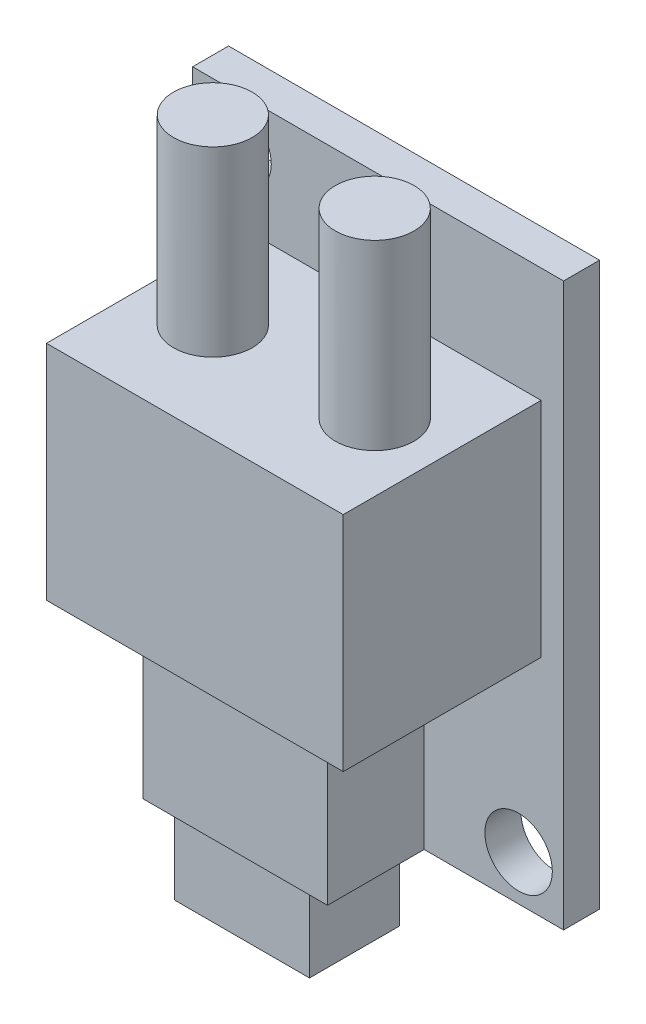
ISO-10303-21;
HEADER;
FILE_DESCRIPTION(('STEP AP214'),'2;1');
FILE_NAME('part.step','',(''),(''),'','','');
FILE_SCHEMA(('AUTOMOTIVE_DESIGN { 1 0 10303 214 1 1 1 1 }'));
ENDSEC;
DATA;
#1=APPLICATION_CONTEXT('core data for automotive mechanical design processes');
#2=APPLICATION_PROTOCOL_DEFINITION('international standard','automotive_design',2000,#1);
#3=PRODUCT_CONTEXT('',#1,'mechanical');
#4=PRODUCT('Part','Part','',(#3));
#5=PRODUCT_RELATED_PRODUCT_CATEGORY('part','',(#4));
#6=PRODUCT_DEFINITION_FORMATION('','',#4);
#7=PRODUCT_DEFINITION_CONTEXT('part definition',#1,'design');
#8=PRODUCT_DEFINITION('design','',#6,#7);
#9=PRODUCT_DEFINITION_SHAPE('','',#8);
#10=(LENGTH_UNIT() NAMED_UNIT(*) SI_UNIT(.MILLI.,.METRE.));
#11=(NAMED_UNIT(*) PLANE_ANGLE_UNIT() SI_UNIT($,.RADIAN.));
#12=(NAMED_UNIT(*) SI_UNIT($,.STERADIAN.) SOLID_ANGLE_UNIT());
#13=UNCERTAINTY_MEASURE_WITH_UNIT(LENGTH_MEASURE(1.E-05),#10,'distance_accuracy_value','');
#14=(GEOMETRIC_REPRESENTATION_CONTEXT(3) GLOBAL_UNCERTAINTY_ASSIGNED_CONTEXT((#13)) GLOBAL_UNIT_ASSIGNED_CONTEXT((#10,
#11,#12)) REPRESENTATION_CONTEXT('',''));
#15=CARTESIAN_POINT('',(0.,0.,0.));
#16=DIRECTION('',(0.,0.,1.));
#17=DIRECTION('',(1.,0.,0.));
#18=AXIS2_PLACEMENT_3D('',#15,#16,#17);
#19=CARTESIAN_POINT('',(-8.24999999999999,-12.5,1.6));
#20=DIRECTION('',(0.,1.,0.));
#21=DIRECTION('',(0.,0.,1.));
#22=AXIS2_PLACEMENT_3D('',#19,#20,#21);
#23=PLANE('',#22);
#24=DIRECTION('',(1.,0.,0.));
#25=VECTOR('',#24,1.);
#26=CARTESIAN_POINT('',(-8.24999999999999,-12.5,0.));
#27=LINE('',#26,#25);
#28=CARTESIAN_POINT('',(-8.24999999999999,-12.5,0.));
#29=VERTEX_POINT('',#28);
#30=CARTESIAN_POINT('',(8.25000000000001,-12.5,0.));
#31=VERTEX_POINT('',#30);
#32=EDGE_CURVE('E280',#29,#31,#27,.T.);
#33=ORIENTED_EDGE('',*,*,#32,.T.);
#34=DIRECTION('',(0.,0.,-1.));
#35=VECTOR('',#34,1.);
#36=CARTESIAN_POINT('',(8.25000000000001,-12.5,1.6));
#37=LINE('',#36,#35);
#38=CARTESIAN_POINT('',(8.25000000000001,-12.5,1.6));
#39=VERTEX_POINT('',#38);
#40=EDGE_CURVE('E290',#39,#31,#37,.T.);
#41=ORIENTED_EDGE('',*,*,#40,.F.);
#42=DIRECTION('',(1.,0.,0.));
#43=VECTOR('',#42,1.);
#44=CARTESIAN_POINT('',(-8.24999999999999,-12.5,1.6));
#45=LINE('',#44,#43);
#46=CARTESIAN_POINT('',(2.05,-12.5,1.6));
#47=VERTEX_POINT('',#46);
#48=EDGE_CURVE('E269',#47,#39,#45,.T.);
#49=ORIENTED_EDGE('',*,*,#48,.F.);
#50=DIRECTION('',(0.,0.,-1.));
#51=VECTOR('',#50,1.);
#52=CARTESIAN_POINT('',(2.05,-12.5,5.9));
#53=LINE('',#52,#51);
#54=CARTESIAN_POINT('',(2.05,-12.5,5.9));
#55=VERTEX_POINT('',#54);
#56=EDGE_CURVE('E208',#55,#47,#53,.T.);
#57=ORIENTED_EDGE('',*,*,#56,.F.);
#58=DIRECTION('',(1.,0.,0.));
#59=VECTOR('',#58,1.);
#60=CARTESIAN_POINT('',(-6.15,-12.5,5.9));
#61=LINE('',#60,#59);
#62=CARTESIAN_POINT('',(-6.15,-12.5,5.9));
#63=VERTEX_POINT('',#62);
#64=EDGE_CURVE('E191',#63,#55,#61,.T.);
#65=ORIENTED_EDGE('',*,*,#64,.F.);
#66=DIRECTION('',(0.,0.,-1.));
#67=VECTOR('',#66,1.);
#68=CARTESIAN_POINT('',(-6.15,-12.5,5.9));
#69=LINE('',#68,#67);
#70=CARTESIAN_POINT('',(-6.15,-12.5,1.6));
#71=VERTEX_POINT('',#70);
#72=EDGE_CURVE('E211',#63,#71,#69,.T.);
#73=ORIENTED_EDGE('',*,*,#72,.T.);
#74=CARTESIAN_POINT('',(-8.24999999999999,-12.5,1.6));
#75=VERTEX_POINT('',#74);
#76=EDGE_CURVE('E271',#75,#71,#45,.T.);
#77=ORIENTED_EDGE('',*,*,#76,.F.);
#78=DIRECTION('',(0.,0.,-1.));
#79=VECTOR('',#78,1.);
#80=CARTESIAN_POINT('',(-8.24999999999999,-12.5,1.6));
#81=LINE('',#80,#79);
#82=EDGE_CURVE('E293',#75,#29,#81,.T.);
#83=ORIENTED_EDGE('',*,*,#82,.T.);
#84=EDGE_LOOP('',(#33,#41,#49,#57,#65,#73,#77,#83));
#85=FACE_BOUND('',#84,.T.);
#86=DIRECTION('',(0.,0.,-1.));
#87=VECTOR('',#86,1.);
#88=CARTESIAN_POINT('',(-5.05,-12.5,5.6));
#89=LINE('',#88,#87);
#90=CARTESIAN_POINT('',(-5.05,-12.5,5.6));
#91=VERTEX_POINT('',#90);
#92=CARTESIAN_POINT('',(-5.05,-12.5,1.6));
#93=VERTEX_POINT('',#92);
#94=EDGE_CURVE('E178',#91,#93,#89,.T.);
#95=ORIENTED_EDGE('',*,*,#94,.F.);
#96=DIRECTION('',(-1.,0.,0.));
#97=VECTOR('',#96,1.);
#98=CARTESIAN_POINT('',(-5.05,-12.5,5.6));
#99=LINE('',#98,#97);
#100=CARTESIAN_POINT('',(0.95,-12.5,5.6));
#101=VERTEX_POINT('',#100);
#102=EDGE_CURVE('E175',#101,#91,#99,.T.);
#103=ORIENTED_EDGE('',*,*,#102,.F.);
#104=DIRECTION('',(0.,0.,1.));
#105=VECTOR('',#104,1.);
#106=CARTESIAN_POINT('',(0.95,-12.5,5.6));
#107=LINE('',#106,#105);
#108=CARTESIAN_POINT('',(0.95,-12.5,1.6));
#109=VERTEX_POINT('',#108);
#110=EDGE_CURVE('E65',#109,#101,#107,.T.);
#111=ORIENTED_EDGE('',*,*,#110,.F.);
#112=DIRECTION('',(1.,0.,0.));
#113=VECTOR('',#112,1.);
#114=CARTESIAN_POINT('',(-5.05,-12.5,1.6));
#115=LINE('',#114,#113);
#116=EDGE_CURVE('E60',#93,#109,#115,.T.);
#117=ORIENTED_EDGE('',*,*,#116,.F.);
#118=EDGE_LOOP('',(#95,#103,#111,#117));
#119=FACE_BOUND('',#118,.T.);
#120=ADVANCED_FACE('F45',(#85,#119),#23,.F.);
#121=CARTESIAN_POINT('',(0.,0.,1.6));
#122=DIRECTION('',(0.,0.,-1.));
#123=DIRECTION('',(-1.,0.,0.));
#124=AXIS2_PLACEMENT_3D('',#121,#122,#123);
#125=PLANE('',#124);
#126=DIRECTION('',(0.,-1.,0.));
#127=VECTOR('',#126,1.);
#128=CARTESIAN_POINT('',(-5.94999999999999,7.4,1.6));
#129=LINE('',#128,#127);
#130=CARTESIAN_POINT('',(-5.94999999999999,7.4,1.6));
#131=VERTEX_POINT('',#130);
#132=CARTESIAN_POINT('',(-5.94999999999999,-2.5,1.6));
#133=VERTEX_POINT('',#132);
#134=EDGE_CURVE('E220',#131,#133,#129,.T.);
#135=ORIENTED_EDGE('',*,*,#134,.F.);
#136=DIRECTION('',(-1.,0.,0.));
#137=VECTOR('',#136,1.);
#138=CARTESIAN_POINT('',(-5.94999999999999,7.4,1.6));
#139=LINE('',#138,#137);
#140=CARTESIAN_POINT('',(7.25,7.4,1.6));
#141=VERTEX_POINT('',#140);
#142=EDGE_CURVE('E225',#141,#131,#139,.T.);
#143=ORIENTED_EDGE('',*,*,#142,.F.);
#144=DIRECTION('',(0.,1.,0.));
#145=VECTOR('',#144,1.);
#146=CARTESIAN_POINT('',(7.25,7.4,1.6));
#147=LINE('',#146,#145);
#148=CARTESIAN_POINT('',(7.25000000000001,-2.5,1.6));
#149=VERTEX_POINT('',#148);
#150=EDGE_CURVE('E237',#149,#141,#147,.T.);
#151=ORIENTED_EDGE('',*,*,#150,.F.);
#152=DIRECTION('',(1.,0.,0.));
#153=VECTOR('',#152,1.);
#154=CARTESIAN_POINT('',(-5.94999999999999,-2.5,1.6));
#155=LINE('',#154,#153);
#156=EDGE_CURVE('E234',#133,#149,#155,.T.);
#157=ORIENTED_EDGE('',*,*,#156,.F.);
#158=EDGE_LOOP('',(#135,#143,#151,#157));
#159=FACE_BOUND('',#158,.T.);
#160=CARTESIAN_POINT('',(6.25000000000001,-10.5,1.6));
#161=DIRECTION('',(0.,0.,1.));
#162=DIRECTION('',(1.,0.,0.));
#163=AXIS2_PLACEMENT_3D('',#160,#161,#162);
#164=CIRCLE('',#163,1.5);
#165=CARTESIAN_POINT('',(7.75000000000001,-10.5,1.6));
#166=VERTEX_POINT('',#165);
#167=EDGE_CURVE('E253',#166,#166,#164,.T.);
#168=ORIENTED_EDGE('',*,*,#167,.F.);
#169=EDGE_LOOP('',(#168));
#170=FACE_BOUND('',#169,.T.);
#171=CARTESIAN_POINT('',(-6.25,10.5,1.6));
#172=DIRECTION('',(0.,0.,1.));
#173=DIRECTION('',(1.,0.,0.));
#174=AXIS2_PLACEMENT_3D('',#171,#172,#173);
#175=CIRCLE('',#174,1.5);
#176=CARTESIAN_POINT('',(-4.75,10.5,1.6));
#177=VERTEX_POINT('',#176);
#178=EDGE_CURVE('E257',#177,#177,#175,.T.);
#179=ORIENTED_EDGE('',*,*,#178,.F.);
#180=EDGE_LOOP('',(#179));
#181=FACE_BOUND('',#180,.T.);
#182=DIRECTION('',(0.,-1.,0.));
#183=VECTOR('',#182,1.);
#184=CARTESIAN_POINT('',(-6.15,-6.89761990591777,1.6));
#185=LINE('',#184,#183);
#186=CARTESIAN_POINT('',(-6.15,-6.89761990591777,1.6));
#187=VERTEX_POINT('',#186);
#188=EDGE_CURVE('E179',#187,#71,#185,.T.);
#189=ORIENTED_EDGE('',*,*,#188,.F.);
#190=DIRECTION('',(-1.,0.,0.));
#191=VECTOR('',#190,1.);
#192=CARTESIAN_POINT('',(-6.15,-6.89761990591777,1.6));
#193=LINE('',#192,#191);
#194=CARTESIAN_POINT('',(2.05,-6.89761990591777,1.6));
#195=VERTEX_POINT('',#194);
#196=EDGE_CURVE('E192',#195,#187,#193,.T.);
#197=ORIENTED_EDGE('',*,*,#196,.F.);
#198=DIRECTION('',(0.,1.,0.));
#199=VECTOR('',#198,1.);
#200=CARTESIAN_POINT('',(2.05,-6.89761990591777,1.6));
#201=LINE('',#200,#199);
#202=EDGE_CURVE('E182',#47,#195,#201,.T.);
#203=ORIENTED_EDGE('',*,*,#202,.F.);
#204=ORIENTED_EDGE('',*,*,#48,.T.);
#205=DIRECTION('',(0.,1.,0.));
#206=VECTOR('',#205,1.);
#207=CARTESIAN_POINT('',(8.25000000000001,-12.5,1.6));
#208=LINE('',#207,#206);
#209=CARTESIAN_POINT('',(8.25,12.5,1.6));
#210=VERTEX_POINT('',#209);
#211=EDGE_CURVE('E273',#39,#210,#208,.T.);
#212=ORIENTED_EDGE('',*,*,#211,.T.);
#213=DIRECTION('',(-1.,0.,0.));
#214=VECTOR('',#213,1.);
#215=CARTESIAN_POINT('',(-8.25,12.5,1.6));
#216=LINE('',#215,#214);
#217=CARTESIAN_POINT('',(-8.25,12.5,1.6));
#218=VERTEX_POINT('',#217);
#219=EDGE_CURVE('E275',#210,#218,#216,.T.);
#220=ORIENTED_EDGE('',*,*,#219,.T.);
#221=DIRECTION('',(0.,-1.,0.));
#222=VECTOR('',#221,1.);
#223=CARTESIAN_POINT('',(-8.24999999999999,-12.5,1.6));
#224=LINE('',#223,#222);
#225=EDGE_CURVE('E266',#218,#75,#224,.T.);
#226=ORIENTED_EDGE('',*,*,#225,.T.);
#227=ORIENTED_EDGE('',*,*,#76,.T.);
#228=EDGE_LOOP('',(#189,#197,#203,#204,#212,#220,#226,#227));
#229=FACE_BOUND('',#228,.T.);
#230=ADVANCED_FACE('F319',(#159,#170,#181,#229),#125,.F.);
#231=CARTESIAN_POINT('',(-8.24999999999999,-12.5,1.6));
#232=DIRECTION('',(1.,0.,0.));
#233=DIRECTION('',(0.,1.,0.));
#234=AXIS2_PLACEMENT_3D('',#231,#232,#233);
#235=PLANE('',#234);
#236=DIRECTION('',(0.,-1.,0.));
#237=VECTOR('',#236,1.);
#238=CARTESIAN_POINT('',(-8.24999999999999,-12.5,0.));
#239=LINE('',#238,#237);
#240=CARTESIAN_POINT('',(-8.25,12.5,0.));
#241=VERTEX_POINT('',#240);
#242=EDGE_CURVE('E263',#241,#29,#239,.T.);
#243=ORIENTED_EDGE('',*,*,#242,.T.);
#244=ORIENTED_EDGE('',*,*,#82,.F.);
#245=ORIENTED_EDGE('',*,*,#225,.F.);
#246=DIRECTION('',(0.,0.,-1.));
#247=VECTOR('',#246,1.);
#248=CARTESIAN_POINT('',(-8.25,12.5,1.6));
#249=LINE('',#248,#247);
#250=EDGE_CURVE('E277',#218,#241,#249,.T.);
#251=ORIENTED_EDGE('',*,*,#250,.T.);
#252=EDGE_LOOP('',(#243,#244,#245,#251));
#253=FACE_BOUND('',#252,.T.);
#254=ADVANCED_FACE('F47',(#253),#235,.F.);
#255=CARTESIAN_POINT('',(8.25000000000001,-12.5,1.6));
#256=DIRECTION('',(-1.,0.,0.));
#257=DIRECTION('',(0.,-1.,0.));
#258=AXIS2_PLACEMENT_3D('',#255,#256,#257);
#259=PLANE('',#258);
#260=DIRECTION('',(0.,1.,0.));
#261=VECTOR('',#260,1.);
#262=CARTESIAN_POINT('',(8.25000000000001,-12.5,0.));
#263=LINE('',#262,#261);
#264=CARTESIAN_POINT('',(8.25,12.5,0.));
#265=VERTEX_POINT('',#264);
#266=EDGE_CURVE('E282',#31,#265,#263,.T.);
#267=ORIENTED_EDGE('',*,*,#266,.T.);
#268=DIRECTION('',(0.,0.,-1.));
#269=VECTOR('',#268,1.);
#270=CARTESIAN_POINT('',(8.25,12.5,1.6));
#271=LINE('',#270,#269);
#272=EDGE_CURVE('E287',#210,#265,#271,.T.);
#273=ORIENTED_EDGE('',*,*,#272,.F.);
#274=ORIENTED_EDGE('',*,*,#211,.F.);
#275=ORIENTED_EDGE('',*,*,#40,.T.);
#276=EDGE_LOOP('',(#267,#273,#274,#275));
#277=FACE_BOUND('',#276,.T.);
#278=ADVANCED_FACE('F339',(#277),#259,.F.);
#279=CARTESIAN_POINT('',(-8.25,12.5,1.6));
#280=DIRECTION('',(0.,-1.,0.));
#281=DIRECTION('',(1.,0.,0.));
#282=AXIS2_PLACEMENT_3D('',#279,#280,#281);
#283=PLANE('',#282);
#284=DIRECTION('',(-1.,0.,0.));
#285=VECTOR('',#284,1.);
#286=CARTESIAN_POINT('',(-8.25,12.5,0.));
#287=LINE('',#286,#285);
#288=EDGE_CURVE('E270',#265,#241,#287,.T.);
#289=ORIENTED_EDGE('',*,*,#288,.T.);
#290=ORIENTED_EDGE('',*,*,#250,.F.);
#291=ORIENTED_EDGE('',*,*,#219,.F.);
#292=ORIENTED_EDGE('',*,*,#272,.T.);
#293=EDGE_LOOP('',(#289,#290,#291,#292));
#294=FACE_BOUND('',#293,.T.);
#295=ADVANCED_FACE('F342',(#294),#283,.F.);
#296=CARTESIAN_POINT('',(0.,0.,0.));
#297=DIRECTION('',(0.,0.,-1.));
#298=DIRECTION('',(-1.,0.,0.));
#299=AXIS2_PLACEMENT_3D('',#296,#297,#298);
#300=PLANE('',#299);
#301=CARTESIAN_POINT('',(6.25000000000001,-10.5,0.));
#302=DIRECTION('',(0.,0.,1.));
#303=DIRECTION('',(1.,0.,0.));
#304=AXIS2_PLACEMENT_3D('',#301,#302,#303);
#305=CIRCLE('',#304,1.5);
#306=CARTESIAN_POINT('',(7.75000000000001,-10.5,0.));
#307=VERTEX_POINT('',#306);
#308=EDGE_CURVE('E254',#307,#307,#305,.T.);
#309=ORIENTED_EDGE('',*,*,#308,.T.);
#310=EDGE_LOOP('',(#309));
#311=FACE_BOUND('',#310,.T.);
#312=CARTESIAN_POINT('',(-6.25,10.5,0.));
#313=DIRECTION('',(0.,0.,1.));
#314=DIRECTION('',(1.,0.,0.));
#315=AXIS2_PLACEMENT_3D('',#312,#313,#314);
#316=CIRCLE('',#315,1.5);
#317=CARTESIAN_POINT('',(-4.75,10.5,0.));
#318=VERTEX_POINT('',#317);
#319=EDGE_CURVE('E260',#318,#318,#316,.T.);
#320=ORIENTED_EDGE('',*,*,#319,.T.);
#321=EDGE_LOOP('',(#320));
#322=FACE_BOUND('',#321,.T.);
#323=ORIENTED_EDGE('',*,*,#242,.F.);
#324=ORIENTED_EDGE('',*,*,#288,.F.);
#325=ORIENTED_EDGE('',*,*,#266,.F.);
#326=ORIENTED_EDGE('',*,*,#32,.F.);
#327=EDGE_LOOP('',(#323,#324,#325,#326));
#328=FACE_BOUND('',#327,.T.);
#329=ADVANCED_FACE('F346',(#311,#322,#328),#300,.T.);
#330=CARTESIAN_POINT('',(-6.25,10.5,0.));
#331=DIRECTION('',(0.,0.,1.));
#332=DIRECTION('',(1.,0.,0.));
#333=AXIS2_PLACEMENT_3D('',#330,#331,#332);
#334=CYLINDRICAL_SURFACE('',#333,1.5);
#335=ORIENTED_EDGE('',*,*,#319,.F.);
#336=EDGE_LOOP('',(#335));
#337=FACE_BOUND('',#336,.T.);
#338=ORIENTED_EDGE('',*,*,#178,.T.);
#339=EDGE_LOOP('',(#338));
#340=FACE_BOUND('',#339,.T.);
#341=ADVANCED_FACE('F349',(#337,#340),#334,.F.);
#342=CARTESIAN_POINT('',(6.25000000000001,-10.5,0.));
#343=DIRECTION('',(0.,0.,1.));
#344=DIRECTION('',(1.,0.,0.));
#345=AXIS2_PLACEMENT_3D('',#342,#343,#344);
#346=CYLINDRICAL_SURFACE('',#345,1.5);
#347=ORIENTED_EDGE('',*,*,#308,.F.);
#348=EDGE_LOOP('',(#347));
#349=FACE_BOUND('',#348,.T.);
#350=ORIENTED_EDGE('',*,*,#167,.T.);
#351=EDGE_LOOP('',(#350));
#352=FACE_BOUND('',#351,.T.);
#353=ADVANCED_FACE('F330',(#349,#352),#346,.F.);
#354=CARTESIAN_POINT('',(-5.94999999999999,7.4,10.4));
#355=DIRECTION('',(1.,0.,0.));
#356=DIRECTION('',(0.,0.,-1.));
#357=AXIS2_PLACEMENT_3D('',#354,#355,#356);
#358=PLANE('',#357);
#359=ORIENTED_EDGE('',*,*,#134,.T.);
#360=DIRECTION('',(0.,0.,-1.));
#361=VECTOR('',#360,1.);
#362=CARTESIAN_POINT('',(-5.94999999999999,-2.5,10.4));
#363=LINE('',#362,#361);
#364=CARTESIAN_POINT('',(-5.94999999999999,-2.5,10.4));
#365=VERTEX_POINT('',#364);
#366=EDGE_CURVE('E250',#365,#133,#363,.T.);
#367=ORIENTED_EDGE('',*,*,#366,.F.);
#368=DIRECTION('',(0.,-1.,0.));
#369=VECTOR('',#368,1.);
#370=CARTESIAN_POINT('',(-5.94999999999999,7.4,10.4));
#371=LINE('',#370,#369);
#372=CARTESIAN_POINT('',(-5.94999999999999,7.4,10.4));
#373=VERTEX_POINT('',#372);
#374=EDGE_CURVE('E221',#373,#365,#371,.T.);
#375=ORIENTED_EDGE('',*,*,#374,.F.);
#376=DIRECTION('',(0.,0.,-1.));
#377=VECTOR('',#376,1.);
#378=CARTESIAN_POINT('',(-5.94999999999999,7.4,10.4));
#379=LINE('',#378,#377);
#380=EDGE_CURVE('E231',#373,#131,#379,.T.);
#381=ORIENTED_EDGE('',*,*,#380,.T.);
#382=EDGE_LOOP('',(#359,#367,#375,#381));
#383=FACE_BOUND('',#382,.T.);
#384=ADVANCED_FACE('F313',(#383),#358,.F.);
#385=CARTESIAN_POINT('',(-5.94999999999999,-2.5,10.4));
#386=DIRECTION('',(0.,1.,0.));
#387=DIRECTION('',(0.,0.,1.));
#388=AXIS2_PLACEMENT_3D('',#385,#386,#387);
#389=PLANE('',#388);
#390=ORIENTED_EDGE('',*,*,#156,.T.);
#391=DIRECTION('',(0.,0.,-1.));
#392=VECTOR('',#391,1.);
#393=CARTESIAN_POINT('',(7.25000000000001,-2.5,10.4));
#394=LINE('',#393,#392);
#395=CARTESIAN_POINT('',(7.25000000000001,-2.5,10.4));
#396=VERTEX_POINT('',#395);
#397=EDGE_CURVE('E247',#396,#149,#394,.T.);
#398=ORIENTED_EDGE('',*,*,#397,.F.);
#399=DIRECTION('',(1.,0.,0.));
#400=VECTOR('',#399,1.);
#401=CARTESIAN_POINT('',(-5.94999999999999,-2.5,10.4));
#402=LINE('',#401,#400);
#403=EDGE_CURVE('E224',#365,#396,#402,.T.);
#404=ORIENTED_EDGE('',*,*,#403,.F.);
#405=ORIENTED_EDGE('',*,*,#366,.T.);
#406=EDGE_LOOP('',(#390,#398,#404,#405));
#407=FACE_BOUND('',#406,.T.);
#408=ADVANCED_FACE('F322',(#407),#389,.F.);
#409=CARTESIAN_POINT('',(7.25,7.4,10.4));
#410=DIRECTION('',(-1.,0.,0.));
#411=DIRECTION('',(0.,-1.,0.));
#412=AXIS2_PLACEMENT_3D('',#409,#410,#411);
#413=PLANE('',#412);
#414=ORIENTED_EDGE('',*,*,#150,.T.);
#415=DIRECTION('',(0.,0.,-1.));
#416=VECTOR('',#415,1.);
#417=CARTESIAN_POINT('',(7.25,7.4,10.4));
#418=LINE('',#417,#416);
#419=CARTESIAN_POINT('',(7.25,7.4,10.4));
#420=VERTEX_POINT('',#419);
#421=EDGE_CURVE('E244',#420,#141,#418,.T.);
#422=ORIENTED_EDGE('',*,*,#421,.F.);
#423=DIRECTION('',(0.,1.,0.));
#424=VECTOR('',#423,1.);
#425=CARTESIAN_POINT('',(7.25,7.4,10.4));
#426=LINE('',#425,#424);
#427=EDGE_CURVE('E227',#396,#420,#426,.T.);
#428=ORIENTED_EDGE('',*,*,#427,.F.);
#429=ORIENTED_EDGE('',*,*,#397,.T.);
#430=EDGE_LOOP('',(#414,#422,#428,#429));
#431=FACE_BOUND('',#430,.T.);
#432=ADVANCED_FACE('F304',(#431),#413,.F.);
#433=CARTESIAN_POINT('',(-5.94999999999999,7.4,10.4));
#434=DIRECTION('',(0.,-1.,0.));
#435=DIRECTION('',(1.,0.,0.));
#436=AXIS2_PLACEMENT_3D('',#433,#434,#435);
#437=PLANE('',#436);
#438=CARTESIAN_POINT('',(4.25,7.4,6.));
#439=DIRECTION('',(0.,-1.,0.));
#440=DIRECTION('',(1.,0.,0.));
#441=AXIS2_PLACEMENT_3D('',#438,#439,#440);
#442=CIRCLE('',#441,1.75);
#443=CARTESIAN_POINT('',(6.,7.4,6.));
#444=VERTEX_POINT('',#443);
#445=EDGE_CURVE('E13',#444,#444,#442,.F.);
#446=ORIENTED_EDGE('',*,*,#445,.F.);
#447=EDGE_LOOP('',(#446));
#448=FACE_BOUND('',#447,.T.);
#449=CARTESIAN_POINT('',(-2.95,7.4,6.));
#450=DIRECTION('',(0.,-1.,0.));
#451=DIRECTION('',(1.,0.,0.));
#452=AXIS2_PLACEMENT_3D('',#449,#450,#451);
#453=CIRCLE('',#452,1.75);
#454=CARTESIAN_POINT('',(-1.2,7.4,6.));
#455=VERTEX_POINT('',#454);
#456=EDGE_CURVE('E53',#455,#455,#453,.F.);
#457=ORIENTED_EDGE('',*,*,#456,.F.);
#458=EDGE_LOOP('',(#457));
#459=FACE_BOUND('',#458,.T.);
#460=ORIENTED_EDGE('',*,*,#142,.T.);
#461=ORIENTED_EDGE('',*,*,#380,.F.);
#462=DIRECTION('',(-1.,0.,0.));
#463=VECTOR('',#462,1.);
#464=CARTESIAN_POINT('',(-5.94999999999999,7.4,10.4));
#465=LINE('',#464,#463);
#466=EDGE_CURVE('E229',#420,#373,#465,.T.);
#467=ORIENTED_EDGE('',*,*,#466,.F.);
#468=ORIENTED_EDGE('',*,*,#421,.T.);
#469=EDGE_LOOP('',(#460,#461,#467,#468));
#470=FACE_BOUND('',#469,.T.);
#471=ADVANCED_FACE('F300',(#448,#459,#470),#437,.F.);
#472=CARTESIAN_POINT('',(0.,0.,10.4));
#473=DIRECTION('',(0.,0.,1.));
#474=DIRECTION('',(1.,0.,0.));
#475=AXIS2_PLACEMENT_3D('',#472,#473,#474);
#476=PLANE('',#475);
#477=ORIENTED_EDGE('',*,*,#374,.T.);
#478=ORIENTED_EDGE('',*,*,#403,.T.);
#479=ORIENTED_EDGE('',*,*,#427,.T.);
#480=ORIENTED_EDGE('',*,*,#466,.T.);
#481=EDGE_LOOP('',(#477,#478,#479,#480));
#482=FACE_BOUND('',#481,.T.);
#483=ADVANCED_FACE('F303',(#482),#476,.T.);
#484=CARTESIAN_POINT('',(-2.95,15.5,6.));
#485=DIRECTION('',(0.,-1.,0.));
#486=DIRECTION('',(0.,0.,-1.));
#487=AXIS2_PLACEMENT_3D('',#484,#485,#486);
#488=CYLINDRICAL_SURFACE('',#487,1.75);
#489=CARTESIAN_POINT('',(-2.95,15.5,6.));
#490=DIRECTION('',(0.,1.,0.));
#491=DIRECTION('',(0.,0.,1.));
#492=AXIS2_PLACEMENT_3D('',#489,#490,#491);
#493=CIRCLE('',#492,1.75);
#494=CARTESIAN_POINT('',(-2.95,15.5,7.75));
#495=VERTEX_POINT('',#494);
#496=EDGE_CURVE('E217',#495,#495,#493,.T.);
#497=ORIENTED_EDGE('',*,*,#496,.F.);
#498=EDGE_LOOP('',(#497));
#499=FACE_BOUND('',#498,.T.);
#500=ORIENTED_EDGE('',*,*,#456,.T.);
#501=EDGE_LOOP('',(#500));
#502=FACE_BOUND('',#501,.T.);
#503=ADVANCED_FACE('F298',(#499,#502),#488,.T.);
#504=CARTESIAN_POINT('',(-2.95,15.5,6.));
#505=DIRECTION('',(0.,1.,0.));
#506=DIRECTION('',(0.,0.,1.));
#507=AXIS2_PLACEMENT_3D('',#504,#505,#506);
#508=PLANE('',#507);
#509=ORIENTED_EDGE('',*,*,#496,.T.);
#510=EDGE_LOOP('',(#509));
#511=FACE_BOUND('',#510,.T.);
#512=ADVANCED_FACE('F457',(#511),#508,.T.);
#513=CARTESIAN_POINT('',(4.25,15.5,6.));
#514=DIRECTION('',(0.,-1.,0.));
#515=DIRECTION('',(0.,0.,-1.));
#516=AXIS2_PLACEMENT_3D('',#513,#514,#515);
#517=CYLINDRICAL_SURFACE('',#516,1.75);
#518=CARTESIAN_POINT('',(4.25,15.5,6.));
#519=DIRECTION('',(0.,1.,0.));
#520=DIRECTION('',(0.,0.,1.));
#521=AXIS2_PLACEMENT_3D('',#518,#519,#520);
#522=CIRCLE('',#521,1.75);
#523=CARTESIAN_POINT('',(4.25,15.5,7.75));
#524=VERTEX_POINT('',#523);
#525=EDGE_CURVE('E214',#524,#524,#522,.T.);
#526=ORIENTED_EDGE('',*,*,#525,.F.);
#527=EDGE_LOOP('',(#526));
#528=FACE_BOUND('',#527,.T.);
#529=ORIENTED_EDGE('',*,*,#445,.T.);
#530=EDGE_LOOP('',(#529));
#531=FACE_BOUND('',#530,.T.);
#532=ADVANCED_FACE('F467',(#528,#531),#517,.T.);
#533=CARTESIAN_POINT('',(4.25,15.5,6.));
#534=DIRECTION('',(0.,1.,0.));
#535=DIRECTION('',(0.,0.,1.));
#536=AXIS2_PLACEMENT_3D('',#533,#534,#535);
#537=PLANE('',#536);
#538=ORIENTED_EDGE('',*,*,#525,.T.);
#539=EDGE_LOOP('',(#538));
#540=FACE_BOUND('',#539,.T.);
#541=ADVANCED_FACE('F477',(#540),#537,.T.);
#542=CARTESIAN_POINT('',(-6.15,-6.89761990591777,5.9));
#543=DIRECTION('',(1.,0.,0.));
#544=DIRECTION('',(0.,1.,0.));
#545=AXIS2_PLACEMENT_3D('',#542,#543,#544);
#546=PLANE('',#545);
#547=ORIENTED_EDGE('',*,*,#188,.T.);
#548=ORIENTED_EDGE('',*,*,#72,.F.);
#549=DIRECTION('',(0.,-1.,0.));
#550=VECTOR('',#549,1.);
#551=CARTESIAN_POINT('',(-6.15,-6.89761990591777,5.9));
#552=LINE('',#551,#550);
#553=CARTESIAN_POINT('',(-6.15,-6.89761990591777,5.9));
#554=VERTEX_POINT('',#553);
#555=EDGE_CURVE('E188',#554,#63,#552,.T.);
#556=ORIENTED_EDGE('',*,*,#555,.F.);
#557=DIRECTION('',(0.,0.,-1.));
#558=VECTOR('',#557,1.);
#559=CARTESIAN_POINT('',(-6.15,-6.89761990591777,5.9));
#560=LINE('',#559,#558);
#561=EDGE_CURVE('E197',#554,#187,#560,.T.);
#562=ORIENTED_EDGE('',*,*,#561,.T.);
#563=EDGE_LOOP('',(#547,#548,#556,#562));
#564=FACE_BOUND('',#563,.T.);
#565=ADVANCED_FACE('F374',(#564),#546,.F.);
#566=CARTESIAN_POINT('',(2.05,-6.89761990591777,5.9));
#567=DIRECTION('',(-1.,0.,0.));
#568=DIRECTION('',(0.,-1.,0.));
#569=AXIS2_PLACEMENT_3D('',#566,#567,#568);
#570=PLANE('',#569);
#571=ORIENTED_EDGE('',*,*,#202,.T.);
#572=DIRECTION('',(0.,0.,-1.));
#573=VECTOR('',#572,1.);
#574=CARTESIAN_POINT('',(2.05,-6.89761990591777,5.9));
#575=LINE('',#574,#573);
#576=CARTESIAN_POINT('',(2.05,-6.89761990591777,5.9));
#577=VERTEX_POINT('',#576);
#578=EDGE_CURVE('E205',#577,#195,#575,.T.);
#579=ORIENTED_EDGE('',*,*,#578,.F.);
#580=DIRECTION('',(0.,1.,0.));
#581=VECTOR('',#580,1.);
#582=CARTESIAN_POINT('',(2.05,-6.89761990591777,5.9));
#583=LINE('',#582,#581);
#584=EDGE_CURVE('E194',#55,#577,#583,.T.);
#585=ORIENTED_EDGE('',*,*,#584,.F.);
#586=ORIENTED_EDGE('',*,*,#56,.T.);
#587=EDGE_LOOP('',(#571,#579,#585,#586));
#588=FACE_BOUND('',#587,.T.);
#589=ADVANCED_FACE('F380',(#588),#570,.F.);
#590=CARTESIAN_POINT('',(-6.15,-6.89761990591777,5.9));
#591=DIRECTION('',(0.,-1.,0.));
#592=DIRECTION('',(0.,0.,-1.));
#593=AXIS2_PLACEMENT_3D('',#590,#591,#592);
#594=PLANE('',#593);
#595=ORIENTED_EDGE('',*,*,#196,.T.);
#596=ORIENTED_EDGE('',*,*,#561,.F.);
#597=DIRECTION('',(-1.,0.,0.));
#598=VECTOR('',#597,1.);
#599=CARTESIAN_POINT('',(-6.15,-6.89761990591777,5.9));
#600=LINE('',#599,#598);
#601=EDGE_CURVE('E196',#577,#554,#600,.T.);
#602=ORIENTED_EDGE('',*,*,#601,.F.);
#603=ORIENTED_EDGE('',*,*,#578,.T.);
#604=EDGE_LOOP('',(#595,#596,#602,#603));
#605=FACE_BOUND('',#604,.T.);
#606=ADVANCED_FACE('F370',(#605),#594,.F.);
#607=CARTESIAN_POINT('',(0.,0.,5.9));
#608=DIRECTION('',(0.,0.,1.));
#609=DIRECTION('',(1.,0.,0.));
#610=AXIS2_PLACEMENT_3D('',#607,#608,#609);
#611=PLANE('',#610);
#612=ORIENTED_EDGE('',*,*,#555,.T.);
#613=ORIENTED_EDGE('',*,*,#64,.T.);
#614=ORIENTED_EDGE('',*,*,#584,.T.);
#615=ORIENTED_EDGE('',*,*,#601,.T.);
#616=EDGE_LOOP('',(#612,#613,#614,#615));
#617=FACE_BOUND('',#616,.T.);
#618=ADVANCED_FACE('F376',(#617),#611,.T.);
#619=CARTESIAN_POINT('',(-5.05,-16.,5.6));
#620=DIRECTION('',(1.,0.,0.));
#621=DIRECTION('',(0.,0.,-1.));
#622=AXIS2_PLACEMENT_3D('',#619,#620,#621);
#623=PLANE('',#622);
#624=ORIENTED_EDGE('',*,*,#94,.T.);
#625=DIRECTION('',(0.,1.,0.));
#626=VECTOR('',#625,1.);
#627=CARTESIAN_POINT('',(-5.05,-16.,1.6));
#628=LINE('',#627,#626);
#629=CARTESIAN_POINT('',(-5.05,-16.,1.6));
#630=VERTEX_POINT('',#629);
#631=EDGE_CURVE('E159',#630,#93,#628,.T.);
#632=ORIENTED_EDGE('',*,*,#631,.F.);
#633=DIRECTION('',(0.,0.,-1.));
#634=VECTOR('',#633,1.);
#635=CARTESIAN_POINT('',(-5.05,-16.,5.6));
#636=LINE('',#635,#634);
#637=CARTESIAN_POINT('',(-5.05,-16.,5.6));
#638=VERTEX_POINT('',#637);
#639=EDGE_CURVE('E166',#638,#630,#636,.T.);
#640=ORIENTED_EDGE('',*,*,#639,.F.);
#641=DIRECTION('',(0.,1.,0.));
#642=VECTOR('',#641,1.);
#643=CARTESIAN_POINT('',(-5.05,-16.,5.6));
#644=LINE('',#643,#642);
#645=EDGE_CURVE('E578',#638,#91,#644,.T.);
#646=ORIENTED_EDGE('',*,*,#645,.T.);
#647=EDGE_LOOP('',(#624,#632,#640,#646));
#648=FACE_BOUND('',#647,.T.);
#649=ADVANCED_FACE('F177',(#648),#623,.F.);
#650=CARTESIAN_POINT('',(-5.05,-16.,1.6));
#651=DIRECTION('',(0.,0.,1.));
#652=DIRECTION('',(1.,0.,0.));
#653=AXIS2_PLACEMENT_3D('',#650,#651,#652);
#654=PLANE('',#653);
#655=ORIENTED_EDGE('',*,*,#116,.T.);
#656=DIRECTION('',(0.,1.,0.));
#657=VECTOR('',#656,1.);
#658=CARTESIAN_POINT('',(0.95,-16.,1.6));
#659=LINE('',#658,#657);
#660=CARTESIAN_POINT('',(0.95,-16.,1.6));
#661=VERTEX_POINT('',#660);
#662=EDGE_CURVE('E162',#661,#109,#659,.T.);
#663=ORIENTED_EDGE('',*,*,#662,.F.);
#664=DIRECTION('',(1.,0.,0.));
#665=VECTOR('',#664,1.);
#666=CARTESIAN_POINT('',(-5.05,-16.,1.6));
#667=LINE('',#666,#665);
#668=EDGE_CURVE('E155',#630,#661,#667,.T.);
#669=ORIENTED_EDGE('',*,*,#668,.F.);
#670=ORIENTED_EDGE('',*,*,#631,.T.);
#671=EDGE_LOOP('',(#655,#663,#669,#670));
#672=FACE_BOUND('',#671,.T.);
#673=ADVANCED_FACE('F157',(#672),#654,.F.);
#674=CARTESIAN_POINT('',(0.95,-16.,5.6));
#675=DIRECTION('',(-1.,0.,0.));
#676=DIRECTION('',(0.,0.,1.));
#677=AXIS2_PLACEMENT_3D('',#674,#675,#676);
#678=PLANE('',#677);
#679=ORIENTED_EDGE('',*,*,#110,.T.);
#680=DIRECTION('',(0.,1.,0.));
#681=VECTOR('',#680,1.);
#682=CARTESIAN_POINT('',(0.95,-16.,5.6));
#683=LINE('',#682,#681);
#684=CARTESIAN_POINT('',(0.95,-16.,5.6));
#685=VERTEX_POINT('',#684);
#686=EDGE_CURVE('E184',#685,#101,#683,.T.);
#687=ORIENTED_EDGE('',*,*,#686,.F.);
#688=DIRECTION('',(0.,0.,1.));
#689=VECTOR('',#688,1.);
#690=CARTESIAN_POINT('',(0.95,-16.,5.6));
#691=LINE('',#690,#689);
#692=EDGE_CURVE('E165',#661,#685,#691,.T.);
#693=ORIENTED_EDGE('',*,*,#692,.F.);
#694=ORIENTED_EDGE('',*,*,#662,.T.);
#695=EDGE_LOOP('',(#679,#687,#693,#694));
#696=FACE_BOUND('',#695,.T.);
#697=ADVANCED_FACE('F545',(#696),#678,.F.);
#698=CARTESIAN_POINT('',(-5.05,-16.,5.6));
#699=DIRECTION('',(0.,0.,-1.));
#700=DIRECTION('',(-1.,0.,0.));
#701=AXIS2_PLACEMENT_3D('',#698,#699,#700);
#702=PLANE('',#701);
#703=ORIENTED_EDGE('',*,*,#102,.T.);
#704=ORIENTED_EDGE('',*,*,#645,.F.);
#705=DIRECTION('',(-1.,0.,0.));
#706=VECTOR('',#705,1.);
#707=CARTESIAN_POINT('',(-5.05,-16.,5.6));
#708=LINE('',#707,#706);
#709=EDGE_CURVE('E171',#685,#638,#708,.T.);
#710=ORIENTED_EDGE('',*,*,#709,.F.);
#711=ORIENTED_EDGE('',*,*,#686,.T.);
#712=EDGE_LOOP('',(#703,#704,#710,#711));
#713=FACE_BOUND('',#712,.T.);
#714=ADVANCED_FACE('F554',(#713),#702,.F.);
#715=CARTESIAN_POINT('',(0.,-16.,0.));
#716=DIRECTION('',(0.,-1.,0.));
#717=DIRECTION('',(0.,0.,-1.));
#718=AXIS2_PLACEMENT_3D('',#715,#716,#717);
#719=PLANE('',#718);
#720=ORIENTED_EDGE('',*,*,#639,.T.);
#721=ORIENTED_EDGE('',*,*,#668,.T.);
#722=ORIENTED_EDGE('',*,*,#692,.T.);
#723=ORIENTED_EDGE('',*,*,#709,.T.);
#724=EDGE_LOOP('',(#720,#721,#722,#723));
#725=FACE_BOUND('',#724,.T.);
#726=ADVANCED_FACE('F169',(#725),#719,.T.);
#727=CLOSED_SHELL('',(#120,#230,#254,#278,#295,#329,#341,#353,#384,#408,#432,#471,#483,#503,
#512,#532,#541,#565,#589,#606,#618,#649,#673,#697,#714,#726));
#728=MANIFOLD_SOLID_BREP('B2',#727);
#729=ADVANCED_BREP_SHAPE_REPRESENTATION('',(#18,#728),#14);
#730=SHAPE_DEFINITION_REPRESENTATION(#9,#729);
ENDSEC;
END-ISO-10303-21;
